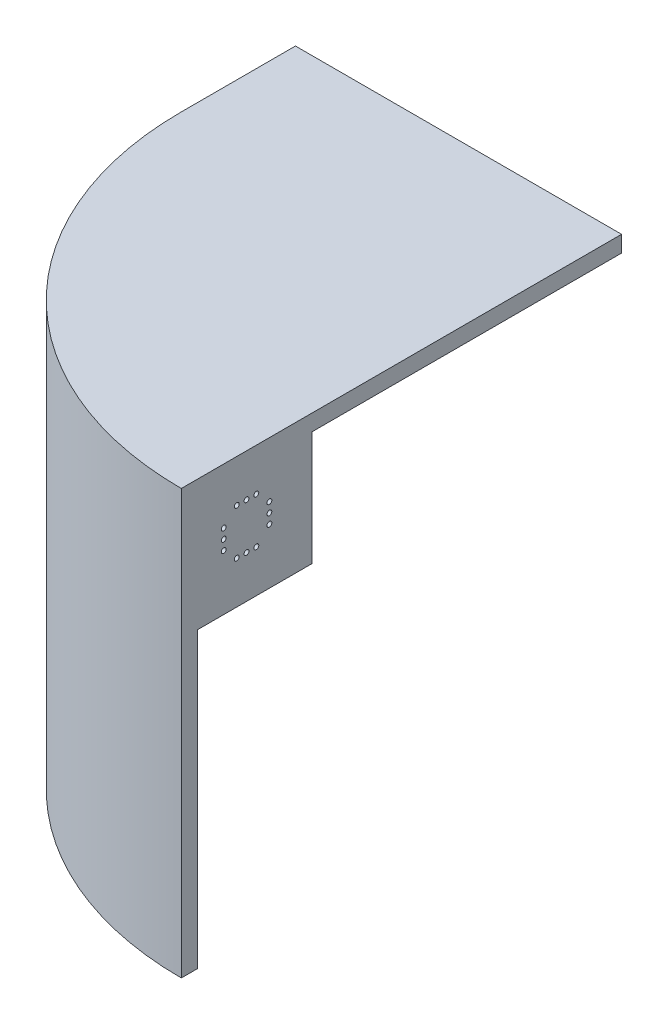
ISO-10303-21;
HEADER;
FILE_DESCRIPTION(('STEP AP214'),'2;1');
FILE_NAME('part.step','',(''),(''),'','','');
FILE_SCHEMA(('AUTOMOTIVE_DESIGN { 1 0 10303 214 1 1 1 1 }'));
ENDSEC;
DATA;
#1=APPLICATION_CONTEXT('core data for automotive mechanical design processes');
#2=APPLICATION_PROTOCOL_DEFINITION('international standard','automotive_design',2000,#1);
#3=PRODUCT_CONTEXT('',#1,'mechanical');
#4=PRODUCT('Part','Part','',(#3));
#5=PRODUCT_RELATED_PRODUCT_CATEGORY('part','',(#4));
#6=PRODUCT_DEFINITION_FORMATION('','',#4);
#7=PRODUCT_DEFINITION_CONTEXT('part definition',#1,'design');
#8=PRODUCT_DEFINITION('design','',#6,#7);
#9=PRODUCT_DEFINITION_SHAPE('','',#8);
#10=(LENGTH_UNIT() NAMED_UNIT(*) SI_UNIT(.MILLI.,.METRE.));
#11=(NAMED_UNIT(*) PLANE_ANGLE_UNIT() SI_UNIT($,.RADIAN.));
#12=(NAMED_UNIT(*) SI_UNIT($,.STERADIAN.) SOLID_ANGLE_UNIT());
#13=UNCERTAINTY_MEASURE_WITH_UNIT(LENGTH_MEASURE(1.E-05),#10,'distance_accuracy_value','');
#14=(GEOMETRIC_REPRESENTATION_CONTEXT(3) GLOBAL_UNCERTAINTY_ASSIGNED_CONTEXT((#13)) GLOBAL_UNIT_ASSIGNED_CONTEXT((#10,
#11,#12)) REPRESENTATION_CONTEXT('',''));
#15=CARTESIAN_POINT('',(0.,0.,0.));
#16=DIRECTION('',(0.,0.,1.));
#17=DIRECTION('',(1.,0.,0.));
#18=AXIS2_PLACEMENT_3D('',#15,#16,#17);
#19=CARTESIAN_POINT('',(0.,130.,-35.));
#20=DIRECTION('',(0.,0.,1.));
#21=DIRECTION('',(1.,0.,0.));
#22=AXIS2_PLACEMENT_3D('',#19,#20,#21);
#23=PLANE('',#22);
#24=DIRECTION('',(1.,0.,0.));
#25=VECTOR('',#24,1.);
#26=CARTESIAN_POINT('',(0.,125.,-35.));
#27=LINE('',#26,#25);
#28=CARTESIAN_POINT('',(-100.,125.,-35.));
#29=VERTEX_POINT('',#28);
#30=CARTESIAN_POINT('',(0.,125.,-35.));
#31=VERTEX_POINT('',#30);
#32=EDGE_CURVE('E142',#29,#31,#27,.T.);
#33=ORIENTED_EDGE('',*,*,#32,.F.);
#34=DIRECTION('',(0.,-1.,0.));
#35=VECTOR('',#34,1.);
#36=CARTESIAN_POINT('',(-100.,130.,-35.));
#37=LINE('',#36,#35);
#38=CARTESIAN_POINT('',(-100.,130.,-35.));
#39=VERTEX_POINT('',#38);
#40=EDGE_CURVE('E176',#39,#29,#37,.T.);
#41=ORIENTED_EDGE('',*,*,#40,.F.);
#42=DIRECTION('',(-1.,0.,0.));
#43=VECTOR('',#42,1.);
#44=CARTESIAN_POINT('',(0.,130.,-35.));
#45=LINE('',#44,#43);
#46=CARTESIAN_POINT('',(0.,130.,-35.));
#47=VERTEX_POINT('',#46);
#48=EDGE_CURVE('E163',#47,#39,#45,.T.);
#49=ORIENTED_EDGE('',*,*,#48,.F.);
#50=DIRECTION('',(0.,-1.,0.));
#51=VECTOR('',#50,1.);
#52=CARTESIAN_POINT('',(0.,130.,-35.));
#53=LINE('',#52,#51);
#54=EDGE_CURVE('E179',#47,#31,#53,.T.);
#55=ORIENTED_EDGE('',*,*,#54,.T.);
#56=EDGE_LOOP('',(#33,#41,#49,#55));
#57=FACE_BOUND('',#56,.T.);
#58=ADVANCED_FACE('F33',(#57),#23,.F.);
#59=CARTESIAN_POINT('',(0.,130.,0.));
#60=DIRECTION('',(0.,-1.,0.));
#61=DIRECTION('',(0.,0.,-1.));
#62=AXIS2_PLACEMENT_3D('',#59,#60,#61);
#63=CYLINDRICAL_SURFACE('',#62,100.);
#64=CARTESIAN_POINT('',(0.,0.,0.));
#65=DIRECTION('',(0.,1.,0.));
#66=DIRECTION('',(0.,0.,1.));
#67=AXIS2_PLACEMENT_3D('',#64,#65,#66);
#68=CIRCLE('',#67,100.);
#69=CARTESIAN_POINT('',(-100.,0.,0.));
#70=VERTEX_POINT('',#69);
#71=CARTESIAN_POINT('',(0.,0.,100.));
#72=VERTEX_POINT('',#71);
#73=EDGE_CURVE('E151',#70,#72,#68,.T.);
#74=ORIENTED_EDGE('',*,*,#73,.T.);
#75=DIRECTION('',(0.,-1.,0.));
#76=VECTOR('',#75,1.);
#77=CARTESIAN_POINT('',(0.,130.,100.));
#78=LINE('',#77,#76);
#79=CARTESIAN_POINT('',(0.,130.,100.));
#80=VERTEX_POINT('',#79);
#81=EDGE_CURVE('E41',#80,#72,#78,.T.);
#82=ORIENTED_EDGE('',*,*,#81,.F.);
#83=CARTESIAN_POINT('',(0.,130.,0.));
#84=DIRECTION('',(0.,1.,0.));
#85=DIRECTION('',(0.,0.,1.));
#86=AXIS2_PLACEMENT_3D('',#83,#84,#85);
#87=CIRCLE('',#86,100.);
#88=CARTESIAN_POINT('',(-100.,130.,0.));
#89=VERTEX_POINT('',#88);
#90=EDGE_CURVE('E157',#89,#80,#87,.T.);
#91=ORIENTED_EDGE('',*,*,#90,.F.);
#92=DIRECTION('',(0.,-1.,0.));
#93=VECTOR('',#92,1.);
#94=CARTESIAN_POINT('',(-100.,130.,0.));
#95=LINE('',#94,#93);
#96=EDGE_CURVE('E167',#89,#70,#95,.T.);
#97=ORIENTED_EDGE('',*,*,#96,.T.);
#98=EDGE_LOOP('',(#74,#82,#91,#97));
#99=FACE_BOUND('',#98,.T.);
#100=ADVANCED_FACE('F35',(#99),#63,.T.);
#101=CARTESIAN_POINT('',(0.,130.,100.));
#102=DIRECTION('',(-1.,0.,0.));
#103=DIRECTION('',(0.,0.,1.));
#104=AXIS2_PLACEMENT_3D('',#101,#102,#103);
#105=PLANE('',#104);
#106=CARTESIAN_POINT('',(0.,103.,82.9999999999995));
#107=DIRECTION('',(1.,0.,0.));
#108=DIRECTION('',(0.,0.,-1.));
#109=AXIS2_PLACEMENT_3D('',#106,#107,#108);
#110=CIRCLE('',#109,0.749999999999995);
#111=CARTESIAN_POINT('',(0.,103.,82.2499999999995));
#112=VERTEX_POINT('',#111);
#113=EDGE_CURVE('E233',#112,#112,#110,.T.);
#114=ORIENTED_EDGE('',*,*,#113,.F.);
#115=EDGE_LOOP('',(#114));
#116=FACE_BOUND('',#115,.T.);
#117=CARTESIAN_POINT('',(0.,103.,76.9999999999995));
#118=DIRECTION('',(1.,0.,0.));
#119=DIRECTION('',(0.,0.,-1.));
#120=AXIS2_PLACEMENT_3D('',#117,#118,#119);
#121=CIRCLE('',#120,0.749999999999995);
#122=CARTESIAN_POINT('',(0.,103.,76.2499999999995));
#123=VERTEX_POINT('',#122);
#124=EDGE_CURVE('E237',#123,#123,#121,.T.);
#125=ORIENTED_EDGE('',*,*,#124,.F.);
#126=EDGE_LOOP('',(#125));
#127=FACE_BOUND('',#126,.T.);
#128=CARTESIAN_POINT('',(0.,103.,79.9999999999995));
#129=DIRECTION('',(1.,0.,0.));
#130=DIRECTION('',(0.,0.,-1.));
#131=AXIS2_PLACEMENT_3D('',#128,#129,#130);
#132=CIRCLE('',#131,0.749999999999995);
#133=CARTESIAN_POINT('',(0.,103.,79.2499999999995));
#134=VERTEX_POINT('',#133);
#135=EDGE_CURVE('E241',#134,#134,#132,.T.);
#136=ORIENTED_EDGE('',*,*,#135,.F.);
#137=EDGE_LOOP('',(#136));
#138=FACE_BOUND('',#137,.T.);
#139=CARTESIAN_POINT('',(0.,117.000000000001,77.0000000000002));
#140=DIRECTION('',(1.,0.,0.));
#141=DIRECTION('',(0.,0.,-1.));
#142=AXIS2_PLACEMENT_3D('',#139,#140,#141);
#143=CIRCLE('',#142,0.749999999999999);
#144=CARTESIAN_POINT('',(0.,117.000000000001,76.2500000000002));
#145=VERTEX_POINT('',#144);
#146=EDGE_CURVE('E245',#145,#145,#143,.T.);
#147=ORIENTED_EDGE('',*,*,#146,.F.);
#148=EDGE_LOOP('',(#147));
#149=FACE_BOUND('',#148,.T.);
#150=CARTESIAN_POINT('',(0.,110.000000000001,72.9999999999997));
#151=DIRECTION('',(1.,0.,0.));
#152=DIRECTION('',(0.,0.,-1.));
#153=AXIS2_PLACEMENT_3D('',#150,#151,#152);
#154=CIRCLE('',#153,0.749999999999995);
#155=CARTESIAN_POINT('',(0.,110.000000000001,72.2499999999997));
#156=VERTEX_POINT('',#155);
#157=EDGE_CURVE('E249',#156,#156,#154,.T.);
#158=ORIENTED_EDGE('',*,*,#157,.F.);
#159=EDGE_LOOP('',(#158));
#160=FACE_BOUND('',#159,.T.);
#161=CARTESIAN_POINT('',(0.,113.000000000001,72.9999999999997));
#162=DIRECTION('',(1.,0.,0.));
#163=DIRECTION('',(0.,0.,-1.));
#164=AXIS2_PLACEMENT_3D('',#161,#162,#163);
#165=CIRCLE('',#164,0.749999999999995);
#166=CARTESIAN_POINT('',(0.,113.000000000001,72.2499999999997));
#167=VERTEX_POINT('',#166);
#168=EDGE_CURVE('E253',#167,#167,#165,.T.);
#169=ORIENTED_EDGE('',*,*,#168,.F.);
#170=EDGE_LOOP('',(#169));
#171=FACE_BOUND('',#170,.T.);
#172=CARTESIAN_POINT('',(0.,107.000000000001,72.9999999999997));
#173=DIRECTION('',(1.,0.,0.));
#174=DIRECTION('',(0.,0.,-1.));
#175=AXIS2_PLACEMENT_3D('',#172,#173,#174);
#176=CIRCLE('',#175,0.749999999999995);
#177=CARTESIAN_POINT('',(0.,107.000000000001,72.2499999999997));
#178=VERTEX_POINT('',#177);
#179=EDGE_CURVE('E257',#178,#178,#176,.T.);
#180=ORIENTED_EDGE('',*,*,#179,.F.);
#181=EDGE_LOOP('',(#180));
#182=FACE_BOUND('',#181,.T.);
#183=CARTESIAN_POINT('',(0.,117.000000000001,83.0000000000002));
#184=DIRECTION('',(1.,0.,0.));
#185=DIRECTION('',(0.,0.,-1.));
#186=AXIS2_PLACEMENT_3D('',#183,#184,#185);
#187=CIRCLE('',#186,0.749999999999999);
#188=CARTESIAN_POINT('',(0.,117.000000000001,82.2500000000002));
#189=VERTEX_POINT('',#188);
#190=EDGE_CURVE('E261',#189,#189,#187,.T.);
#191=ORIENTED_EDGE('',*,*,#190,.F.);
#192=EDGE_LOOP('',(#191));
#193=FACE_BOUND('',#192,.T.);
#194=CARTESIAN_POINT('',(0.,117.000000000001,80.0000000000002));
#195=DIRECTION('',(1.,0.,0.));
#196=DIRECTION('',(0.,0.,-1.));
#197=AXIS2_PLACEMENT_3D('',#194,#195,#196);
#198=CIRCLE('',#197,0.749999999999999);
#199=CARTESIAN_POINT('',(0.,117.000000000001,79.2500000000002));
#200=VERTEX_POINT('',#199);
#201=EDGE_CURVE('E265',#200,#200,#198,.T.);
#202=ORIENTED_EDGE('',*,*,#201,.F.);
#203=EDGE_LOOP('',(#202));
#204=FACE_BOUND('',#203,.T.);
#205=CARTESIAN_POINT('',(0.,113.,87.));
#206=DIRECTION('',(1.,0.,0.));
#207=DIRECTION('',(0.,0.,-1.));
#208=AXIS2_PLACEMENT_3D('',#205,#206,#207);
#209=CIRCLE('',#208,0.749999999999999);
#210=CARTESIAN_POINT('',(0.,113.,86.25));
#211=VERTEX_POINT('',#210);
#212=EDGE_CURVE('E269',#211,#211,#209,.T.);
#213=ORIENTED_EDGE('',*,*,#212,.F.);
#214=EDGE_LOOP('',(#213));
#215=FACE_BOUND('',#214,.T.);
#216=CARTESIAN_POINT('',(0.,107.,87.));
#217=DIRECTION('',(1.,0.,0.));
#218=DIRECTION('',(0.,0.,-1.));
#219=AXIS2_PLACEMENT_3D('',#216,#217,#218);
#220=CIRCLE('',#219,0.749999999999999);
#221=CARTESIAN_POINT('',(0.,107.,86.25));
#222=VERTEX_POINT('',#221);
#223=EDGE_CURVE('E273',#222,#222,#220,.T.);
#224=ORIENTED_EDGE('',*,*,#223,.F.);
#225=EDGE_LOOP('',(#224));
#226=FACE_BOUND('',#225,.T.);
#227=CARTESIAN_POINT('',(0.,110.,87.));
#228=DIRECTION('',(1.,0.,0.));
#229=DIRECTION('',(0.,0.,-1.));
#230=AXIS2_PLACEMENT_3D('',#227,#228,#229);
#231=CIRCLE('',#230,0.749999999999999);
#232=CARTESIAN_POINT('',(0.,110.,86.25));
#233=VERTEX_POINT('',#232);
#234=EDGE_CURVE('E276',#233,#233,#231,.T.);
#235=ORIENTED_EDGE('',*,*,#234,.F.);
#236=EDGE_LOOP('',(#235));
#237=FACE_BOUND('',#236,.T.);
#238=DIRECTION('',(0.,-1.,0.));
#239=VECTOR('',#238,1.);
#240=CARTESIAN_POINT('',(0.,125.,95.));
#241=LINE('',#240,#239);
#242=CARTESIAN_POINT('',(0.,90.,95.));
#243=VERTEX_POINT('',#242);
#244=CARTESIAN_POINT('',(0.,0.,95.));
#245=VERTEX_POINT('',#244);
#246=EDGE_CURVE('E149',#243,#245,#241,.T.);
#247=ORIENTED_EDGE('',*,*,#246,.F.);
#248=DIRECTION('',(0.,0.,-1.));
#249=VECTOR('',#248,1.);
#250=CARTESIAN_POINT('',(0.,90.,95.));
#251=LINE('',#250,#249);
#252=CARTESIAN_POINT('',(0.,90.,60.));
#253=VERTEX_POINT('',#252);
#254=EDGE_CURVE('E129',#243,#253,#251,.T.);
#255=ORIENTED_EDGE('',*,*,#254,.T.);
#256=DIRECTION('',(0.,1.,0.));
#257=VECTOR('',#256,1.);
#258=CARTESIAN_POINT('',(0.,125.,60.));
#259=LINE('',#258,#257);
#260=CARTESIAN_POINT('',(0.,125.,60.));
#261=VERTEX_POINT('',#260);
#262=EDGE_CURVE('E112',#253,#261,#259,.T.);
#263=ORIENTED_EDGE('',*,*,#262,.T.);
#264=DIRECTION('',(0.,0.,1.));
#265=VECTOR('',#264,1.);
#266=CARTESIAN_POINT('',(0.,125.,95.));
#267=LINE('',#266,#265);
#268=EDGE_CURVE('E144',#31,#261,#267,.T.);
#269=ORIENTED_EDGE('',*,*,#268,.F.);
#270=ORIENTED_EDGE('',*,*,#54,.F.);
#271=DIRECTION('',(0.,0.,-1.));
#272=VECTOR('',#271,1.);
#273=CARTESIAN_POINT('',(0.,130.,100.));
#274=LINE('',#273,#272);
#275=EDGE_CURVE('E160',#80,#47,#274,.T.);
#276=ORIENTED_EDGE('',*,*,#275,.F.);
#277=ORIENTED_EDGE('',*,*,#81,.T.);
#278=DIRECTION('',(0.,0.,-1.));
#279=VECTOR('',#278,1.);
#280=CARTESIAN_POINT('',(0.,0.,100.));
#281=LINE('',#280,#279);
#282=EDGE_CURVE('E170',#72,#245,#281,.T.);
#283=ORIENTED_EDGE('',*,*,#282,.T.);
#284=EDGE_LOOP('',(#247,#255,#263,#269,#270,#276,#277,#283));
#285=FACE_BOUND('',#284,.T.);
#286=ADVANCED_FACE('F184',(#116,#127,#138,#149,#160,#171,#182,#193,#204,#215,#226,#237,#285),
#105,.F.);
#287=CARTESIAN_POINT('',(-100.,130.,-35.));
#288=DIRECTION('',(1.,0.,0.));
#289=DIRECTION('',(0.,0.,-1.));
#290=AXIS2_PLACEMENT_3D('',#287,#288,#289);
#291=PLANE('',#290);
#292=DIRECTION('',(0.,0.,1.));
#293=VECTOR('',#292,1.);
#294=CARTESIAN_POINT('',(-100.,0.,-35.));
#295=LINE('',#294,#293);
#296=CARTESIAN_POINT('',(-100.,0.,-35.));
#297=VERTEX_POINT('',#296);
#298=EDGE_CURVE('E161',#297,#70,#295,.T.);
#299=ORIENTED_EDGE('',*,*,#298,.T.);
#300=ORIENTED_EDGE('',*,*,#96,.F.);
#301=DIRECTION('',(0.,0.,1.));
#302=VECTOR('',#301,1.);
#303=CARTESIAN_POINT('',(-100.,130.,-35.));
#304=LINE('',#303,#302);
#305=EDGE_CURVE('E165',#39,#89,#304,.T.);
#306=ORIENTED_EDGE('',*,*,#305,.F.);
#307=ORIENTED_EDGE('',*,*,#40,.T.);
#308=DIRECTION('',(0.,-1.,0.));
#309=VECTOR('',#308,1.);
#310=CARTESIAN_POINT('',(-100.,125.,-35.));
#311=LINE('',#310,#309);
#312=EDGE_CURVE('E152',#29,#297,#311,.T.);
#313=ORIENTED_EDGE('',*,*,#312,.T.);
#314=EDGE_LOOP('',(#299,#300,#306,#307,#313));
#315=FACE_BOUND('',#314,.T.);
#316=ADVANCED_FACE('F209',(#315),#291,.F.);
#317=CARTESIAN_POINT('',(0.,130.,0.));
#318=DIRECTION('',(0.,1.,0.));
#319=DIRECTION('',(0.,0.,1.));
#320=AXIS2_PLACEMENT_3D('',#317,#318,#319);
#321=PLANE('',#320);
#322=ORIENTED_EDGE('',*,*,#90,.T.);
#323=ORIENTED_EDGE('',*,*,#275,.T.);
#324=ORIENTED_EDGE('',*,*,#48,.T.);
#325=ORIENTED_EDGE('',*,*,#305,.T.);
#326=EDGE_LOOP('',(#322,#323,#324,#325));
#327=FACE_BOUND('',#326,.T.);
#328=ADVANCED_FACE('F211',(#327),#321,.T.);
#329=CARTESIAN_POINT('',(0.,0.,0.));
#330=DIRECTION('',(0.,1.,0.));
#331=DIRECTION('',(0.,0.,1.));
#332=AXIS2_PLACEMENT_3D('',#329,#330,#331);
#333=PLANE('',#332);
#334=DIRECTION('',(-0.14142135623731,0.,-0.989949493661166));
#335=VECTOR('',#334,1.);
#336=CARTESIAN_POINT('',(-100.,0.,-35.));
#337=LINE('',#336,#335);
#338=CARTESIAN_POINT('',(-95.,0.,0.));
#339=VERTEX_POINT('',#338);
#340=EDGE_CURVE('E139',#339,#297,#337,.T.);
#341=ORIENTED_EDGE('',*,*,#340,.F.);
#342=CARTESIAN_POINT('',(0.,0.,0.));
#343=DIRECTION('',(0.,-1.,0.));
#344=DIRECTION('',(0.,0.,-1.));
#345=AXIS2_PLACEMENT_3D('',#342,#343,#344);
#346=CIRCLE('',#345,95.);
#347=EDGE_CURVE('E135',#245,#339,#346,.T.);
#348=ORIENTED_EDGE('',*,*,#347,.F.);
#349=ORIENTED_EDGE('',*,*,#282,.F.);
#350=ORIENTED_EDGE('',*,*,#73,.F.);
#351=ORIENTED_EDGE('',*,*,#298,.F.);
#352=EDGE_LOOP('',(#341,#348,#349,#350,#351));
#353=FACE_BOUND('',#352,.T.);
#354=ADVANCED_FACE('F193',(#353),#333,.F.);
#355=CARTESIAN_POINT('',(0.,125.,0.));
#356=DIRECTION('',(0.,-1.,0.));
#357=DIRECTION('',(0.,0.,-1.));
#358=AXIS2_PLACEMENT_3D('',#355,#356,#357);
#359=CYLINDRICAL_SURFACE('',#358,95.);
#360=DIRECTION('',(0.,-1.,0.));
#361=VECTOR('',#360,1.);
#362=CARTESIAN_POINT('',(-5.,125.,94.8683298050514));
#363=LINE('',#362,#361);
#364=CARTESIAN_POINT('',(-5.,90.,94.8683298050514));
#365=VERTEX_POINT('',#364);
#366=CARTESIAN_POINT('',(-5.,125.,94.8683298050514));
#367=VERTEX_POINT('',#366);
#368=EDGE_CURVE('E47',#365,#367,#363,.F.);
#369=ORIENTED_EDGE('',*,*,#368,.F.);
#370=CARTESIAN_POINT('',(0.,90.,0.));
#371=DIRECTION('',(0.,-1.,0.));
#372=DIRECTION('',(0.,0.,-1.));
#373=AXIS2_PLACEMENT_3D('',#370,#371,#372);
#374=CIRCLE('',#373,95.);
#375=EDGE_CURVE('E11',#365,#243,#374,.F.);
#376=ORIENTED_EDGE('',*,*,#375,.T.);
#377=ORIENTED_EDGE('',*,*,#246,.T.);
#378=ORIENTED_EDGE('',*,*,#347,.T.);
#379=DIRECTION('',(0.,-1.,0.));
#380=VECTOR('',#379,1.);
#381=CARTESIAN_POINT('',(-95.,125.,0.));
#382=LINE('',#381,#380);
#383=CARTESIAN_POINT('',(-95.,125.,0.));
#384=VERTEX_POINT('',#383);
#385=EDGE_CURVE('E146',#384,#339,#382,.T.);
#386=ORIENTED_EDGE('',*,*,#385,.F.);
#387=CARTESIAN_POINT('',(0.,125.,0.));
#388=DIRECTION('',(0.,-1.,0.));
#389=DIRECTION('',(0.,0.,-1.));
#390=AXIS2_PLACEMENT_3D('',#387,#388,#389);
#391=CIRCLE('',#390,95.);
#392=EDGE_CURVE('E136',#367,#384,#391,.T.);
#393=ORIENTED_EDGE('',*,*,#392,.F.);
#394=EDGE_LOOP('',(#369,#376,#377,#378,#386,#393));
#395=FACE_BOUND('',#394,.T.);
#396=ADVANCED_FACE('F196',(#395),#359,.F.);
#397=CARTESIAN_POINT('',(-100.,125.,-35.));
#398=DIRECTION('',(-0.989949493661167,0.,0.14142135623731));
#399=DIRECTION('',(0.14142135623731,0.,0.989949493661166));
#400=AXIS2_PLACEMENT_3D('',#397,#398,#399);
#401=PLANE('',#400);
#402=ORIENTED_EDGE('',*,*,#340,.T.);
#403=ORIENTED_EDGE('',*,*,#312,.F.);
#404=DIRECTION('',(-0.14142135623731,0.,-0.989949493661166));
#405=VECTOR('',#404,1.);
#406=CARTESIAN_POINT('',(-100.,125.,-35.));
#407=LINE('',#406,#405);
#408=EDGE_CURVE('E138',#384,#29,#407,.T.);
#409=ORIENTED_EDGE('',*,*,#408,.F.);
#410=ORIENTED_EDGE('',*,*,#385,.T.);
#411=EDGE_LOOP('',(#402,#403,#409,#410));
#412=FACE_BOUND('',#411,.T.);
#413=ADVANCED_FACE('F199',(#412),#401,.F.);
#414=CARTESIAN_POINT('',(0.,125.,0.));
#415=DIRECTION('',(0.,-1.,0.));
#416=DIRECTION('',(0.,0.,-1.));
#417=AXIS2_PLACEMENT_3D('',#414,#415,#416);
#418=PLANE('',#417);
#419=DIRECTION('',(1.,0.,0.));
#420=VECTOR('',#419,1.);
#421=CARTESIAN_POINT('',(-5.,125.,60.));
#422=LINE('',#421,#420);
#423=CARTESIAN_POINT('',(-5.,125.,60.));
#424=VERTEX_POINT('',#423);
#425=EDGE_CURVE('E121',#424,#261,#422,.T.);
#426=ORIENTED_EDGE('',*,*,#425,.F.);
#427=DIRECTION('',(0.,0.,1.));
#428=VECTOR('',#427,1.);
#429=CARTESIAN_POINT('',(-5.,125.,95.));
#430=LINE('',#429,#428);
#431=EDGE_CURVE('E122',#424,#367,#430,.T.);
#432=ORIENTED_EDGE('',*,*,#431,.T.);
#433=ORIENTED_EDGE('',*,*,#392,.T.);
#434=ORIENTED_EDGE('',*,*,#408,.T.);
#435=ORIENTED_EDGE('',*,*,#32,.T.);
#436=ORIENTED_EDGE('',*,*,#268,.T.);
#437=EDGE_LOOP('',(#426,#432,#433,#434,#435,#436));
#438=FACE_BOUND('',#437,.T.);
#439=ADVANCED_FACE('F202',(#438),#418,.T.);
#440=CARTESIAN_POINT('',(-5.,90.,95.));
#441=DIRECTION('',(0.,-1.,0.));
#442=DIRECTION('',(0.,0.,-1.));
#443=AXIS2_PLACEMENT_3D('',#440,#441,#442);
#444=PLANE('',#443);
#445=ORIENTED_EDGE('',*,*,#375,.F.);
#446=DIRECTION('',(0.,0.,-1.));
#447=VECTOR('',#446,1.);
#448=CARTESIAN_POINT('',(-5.,90.,95.));
#449=LINE('',#448,#447);
#450=CARTESIAN_POINT('',(-5.,90.,60.));
#451=VERTEX_POINT('',#450);
#452=EDGE_CURVE('E103',#365,#451,#449,.T.);
#453=ORIENTED_EDGE('',*,*,#452,.T.);
#454=DIRECTION('',(1.,0.,0.));
#455=VECTOR('',#454,1.);
#456=CARTESIAN_POINT('',(-5.,90.,60.));
#457=LINE('',#456,#455);
#458=EDGE_CURVE('E107',#451,#253,#457,.T.);
#459=ORIENTED_EDGE('',*,*,#458,.T.);
#460=ORIENTED_EDGE('',*,*,#254,.F.);
#461=EDGE_LOOP('',(#445,#453,#459,#460));
#462=FACE_BOUND('',#461,.T.);
#463=ADVANCED_FACE('F105',(#462),#444,.T.);
#464=CARTESIAN_POINT('',(-5.,0.,0.));
#465=DIRECTION('',(1.,0.,0.));
#466=DIRECTION('',(0.,0.,-1.));
#467=AXIS2_PLACEMENT_3D('',#464,#465,#466);
#468=PLANE('',#467);
#469=CARTESIAN_POINT('',(-5.,103.,82.9999999999995));
#470=DIRECTION('',(1.,0.,0.));
#471=DIRECTION('',(0.,0.,-1.));
#472=AXIS2_PLACEMENT_3D('',#469,#470,#471);
#473=CIRCLE('',#472,0.749999999999995);
#474=CARTESIAN_POINT('',(-5.,103.,82.2499999999995));
#475=VERTEX_POINT('',#474);
#476=EDGE_CURVE('E284',#475,#475,#473,.F.);
#477=ORIENTED_EDGE('',*,*,#476,.F.);
#478=EDGE_LOOP('',(#477));
#479=FACE_BOUND('',#478,.T.);
#480=CARTESIAN_POINT('',(-5.,103.,76.9999999999995));
#481=DIRECTION('',(1.,0.,0.));
#482=DIRECTION('',(0.,0.,-1.));
#483=AXIS2_PLACEMENT_3D('',#480,#481,#482);
#484=CIRCLE('',#483,0.749999999999995);
#485=CARTESIAN_POINT('',(-5.,103.,76.2499999999995));
#486=VERTEX_POINT('',#485);
#487=EDGE_CURVE('E288',#486,#486,#484,.F.);
#488=ORIENTED_EDGE('',*,*,#487,.F.);
#489=EDGE_LOOP('',(#488));
#490=FACE_BOUND('',#489,.T.);
#491=CARTESIAN_POINT('',(-5.,103.,79.9999999999995));
#492=DIRECTION('',(1.,0.,0.));
#493=DIRECTION('',(0.,0.,-1.));
#494=AXIS2_PLACEMENT_3D('',#491,#492,#493);
#495=CIRCLE('',#494,0.749999999999995);
#496=CARTESIAN_POINT('',(-5.,103.,79.2499999999995));
#497=VERTEX_POINT('',#496);
#498=EDGE_CURVE('E292',#497,#497,#495,.F.);
#499=ORIENTED_EDGE('',*,*,#498,.F.);
#500=EDGE_LOOP('',(#499));
#501=FACE_BOUND('',#500,.T.);
#502=CARTESIAN_POINT('',(-5.,117.000000000001,77.0000000000002));
#503=DIRECTION('',(1.,0.,0.));
#504=DIRECTION('',(0.,0.,-1.));
#505=AXIS2_PLACEMENT_3D('',#502,#503,#504);
#506=CIRCLE('',#505,0.749999999999999);
#507=CARTESIAN_POINT('',(-5.,117.000000000001,76.2500000000002));
#508=VERTEX_POINT('',#507);
#509=EDGE_CURVE('E301',#508,#508,#506,.F.);
#510=ORIENTED_EDGE('',*,*,#509,.F.);
#511=EDGE_LOOP('',(#510));
#512=FACE_BOUND('',#511,.T.);
#513=CARTESIAN_POINT('',(-5.,110.000000000001,72.9999999999997));
#514=DIRECTION('',(1.,0.,0.));
#515=DIRECTION('',(0.,0.,-1.));
#516=AXIS2_PLACEMENT_3D('',#513,#514,#515);
#517=CIRCLE('',#516,0.749999999999995);
#518=CARTESIAN_POINT('',(-5.,110.000000000001,72.2499999999997));
#519=VERTEX_POINT('',#518);
#520=EDGE_CURVE('E296',#519,#519,#517,.F.);
#521=ORIENTED_EDGE('',*,*,#520,.F.);
#522=EDGE_LOOP('',(#521));
#523=FACE_BOUND('',#522,.T.);
#524=CARTESIAN_POINT('',(-5.,113.000000000001,72.9999999999997));
#525=DIRECTION('',(1.,0.,0.));
#526=DIRECTION('',(0.,0.,-1.));
#527=AXIS2_PLACEMENT_3D('',#524,#525,#526);
#528=CIRCLE('',#527,0.749999999999995);
#529=CARTESIAN_POINT('',(-5.,113.000000000001,72.2499999999997));
#530=VERTEX_POINT('',#529);
#531=EDGE_CURVE('E300',#530,#530,#528,.F.);
#532=ORIENTED_EDGE('',*,*,#531,.F.);
#533=EDGE_LOOP('',(#532));
#534=FACE_BOUND('',#533,.T.);
#535=CARTESIAN_POINT('',(-5.,107.000000000001,72.9999999999997));
#536=DIRECTION('',(1.,0.,0.));
#537=DIRECTION('',(0.,0.,-1.));
#538=AXIS2_PLACEMENT_3D('',#535,#536,#537);
#539=CIRCLE('',#538,0.749999999999995);
#540=CARTESIAN_POINT('',(-5.,107.000000000001,72.2499999999997));
#541=VERTEX_POINT('',#540);
#542=EDGE_CURVE('E305',#541,#541,#539,.F.);
#543=ORIENTED_EDGE('',*,*,#542,.F.);
#544=EDGE_LOOP('',(#543));
#545=FACE_BOUND('',#544,.T.);
#546=CARTESIAN_POINT('',(-5.,117.000000000001,83.0000000000002));
#547=DIRECTION('',(1.,0.,0.));
#548=DIRECTION('',(0.,0.,-1.));
#549=AXIS2_PLACEMENT_3D('',#546,#547,#548);
#550=CIRCLE('',#549,0.749999999999999);
#551=CARTESIAN_POINT('',(-5.,117.000000000001,82.2500000000002));
#552=VERTEX_POINT('',#551);
#553=EDGE_CURVE('E312',#552,#552,#550,.F.);
#554=ORIENTED_EDGE('',*,*,#553,.F.);
#555=EDGE_LOOP('',(#554));
#556=FACE_BOUND('',#555,.T.);
#557=CARTESIAN_POINT('',(-5.,117.000000000001,80.0000000000002));
#558=DIRECTION('',(1.,0.,0.));
#559=DIRECTION('',(0.,0.,-1.));
#560=AXIS2_PLACEMENT_3D('',#557,#558,#559);
#561=CIRCLE('',#560,0.749999999999999);
#562=CARTESIAN_POINT('',(-5.,117.000000000001,79.2500000000002));
#563=VERTEX_POINT('',#562);
#564=EDGE_CURVE('E316',#563,#563,#561,.F.);
#565=ORIENTED_EDGE('',*,*,#564,.F.);
#566=EDGE_LOOP('',(#565));
#567=FACE_BOUND('',#566,.T.);
#568=CARTESIAN_POINT('',(-5.,113.,87.));
#569=DIRECTION('',(1.,0.,0.));
#570=DIRECTION('',(0.,0.,-1.));
#571=AXIS2_PLACEMENT_3D('',#568,#569,#570);
#572=CIRCLE('',#571,0.749999999999999);
#573=CARTESIAN_POINT('',(-5.,113.,86.25));
#574=VERTEX_POINT('',#573);
#575=EDGE_CURVE('E320',#574,#574,#572,.F.);
#576=ORIENTED_EDGE('',*,*,#575,.F.);
#577=EDGE_LOOP('',(#576));
#578=FACE_BOUND('',#577,.T.);
#579=CARTESIAN_POINT('',(-5.,107.,87.));
#580=DIRECTION('',(1.,0.,0.));
#581=DIRECTION('',(0.,0.,-1.));
#582=AXIS2_PLACEMENT_3D('',#579,#580,#581);
#583=CIRCLE('',#582,0.749999999999999);
#584=CARTESIAN_POINT('',(-5.,107.,86.25));
#585=VERTEX_POINT('',#584);
#586=EDGE_CURVE('E278',#585,#585,#583,.F.);
#587=ORIENTED_EDGE('',*,*,#586,.F.);
#588=EDGE_LOOP('',(#587));
#589=FACE_BOUND('',#588,.T.);
#590=CARTESIAN_POINT('',(-5.,110.,87.));
#591=DIRECTION('',(1.,0.,0.));
#592=DIRECTION('',(0.,0.,-1.));
#593=AXIS2_PLACEMENT_3D('',#590,#591,#592);
#594=CIRCLE('',#593,0.749999999999999);
#595=CARTESIAN_POINT('',(-5.,110.,86.25));
#596=VERTEX_POINT('',#595);
#597=EDGE_CURVE('E131',#596,#596,#594,.F.);
#598=ORIENTED_EDGE('',*,*,#597,.F.);
#599=EDGE_LOOP('',(#598));
#600=FACE_BOUND('',#599,.T.);
#601=ORIENTED_EDGE('',*,*,#452,.F.);
#602=ORIENTED_EDGE('',*,*,#368,.T.);
#603=ORIENTED_EDGE('',*,*,#431,.F.);
#604=DIRECTION('',(0.,1.,0.));
#605=VECTOR('',#604,1.);
#606=CARTESIAN_POINT('',(-5.,125.,60.));
#607=LINE('',#606,#605);
#608=EDGE_CURVE('E111',#451,#424,#607,.T.);
#609=ORIENTED_EDGE('',*,*,#608,.F.);
#610=EDGE_LOOP('',(#601,#602,#603,#609));
#611=FACE_BOUND('',#610,.T.);
#612=ADVANCED_FACE('F124',(#479,#490,#501,#512,#523,#534,#545,#556,#567,#578,#589,#600,#611),
#468,.F.);
#613=CARTESIAN_POINT('',(-5.,125.,60.));
#614=DIRECTION('',(0.,0.,-1.));
#615=DIRECTION('',(-1.,0.,0.));
#616=AXIS2_PLACEMENT_3D('',#613,#614,#615);
#617=PLANE('',#616);
#618=ORIENTED_EDGE('',*,*,#262,.F.);
#619=ORIENTED_EDGE('',*,*,#458,.F.);
#620=ORIENTED_EDGE('',*,*,#608,.T.);
#621=ORIENTED_EDGE('',*,*,#425,.T.);
#622=EDGE_LOOP('',(#618,#619,#620,#621));
#623=FACE_BOUND('',#622,.T.);
#624=ADVANCED_FACE('F116',(#623),#617,.T.);
#625=CARTESIAN_POINT('',(-7.12132034355964,110.,87.));
#626=DIRECTION('',(1.,0.,0.));
#627=DIRECTION('',(0.,0.,-1.));
#628=AXIS2_PLACEMENT_3D('',#625,#626,#627);
#629=CYLINDRICAL_SURFACE('',#628,0.749999999999999);
#630=ORIENTED_EDGE('',*,*,#597,.T.);
#631=EDGE_LOOP('',(#630));
#632=FACE_BOUND('',#631,.T.);
#633=ORIENTED_EDGE('',*,*,#234,.T.);
#634=EDGE_LOOP('',(#633));
#635=FACE_BOUND('',#634,.T.);
#636=ADVANCED_FACE('F328',(#632,#635),#629,.F.);
#637=CARTESIAN_POINT('',(-7.12132034355964,107.,87.));
#638=DIRECTION('',(1.,0.,0.));
#639=DIRECTION('',(0.,0.,-1.));
#640=AXIS2_PLACEMENT_3D('',#637,#638,#639);
#641=CYLINDRICAL_SURFACE('',#640,0.749999999999999);
#642=ORIENTED_EDGE('',*,*,#586,.T.);
#643=EDGE_LOOP('',(#642));
#644=FACE_BOUND('',#643,.T.);
#645=ORIENTED_EDGE('',*,*,#223,.T.);
#646=EDGE_LOOP('',(#645));
#647=FACE_BOUND('',#646,.T.);
#648=ADVANCED_FACE('F325',(#644,#647),#641,.F.);
#649=CARTESIAN_POINT('',(-7.12132034355964,113.,87.));
#650=DIRECTION('',(1.,0.,0.));
#651=DIRECTION('',(0.,0.,-1.));
#652=AXIS2_PLACEMENT_3D('',#649,#650,#651);
#653=CYLINDRICAL_SURFACE('',#652,0.749999999999999);
#654=ORIENTED_EDGE('',*,*,#575,.T.);
#655=EDGE_LOOP('',(#654));
#656=FACE_BOUND('',#655,.T.);
#657=ORIENTED_EDGE('',*,*,#212,.T.);
#658=EDGE_LOOP('',(#657));
#659=FACE_BOUND('',#658,.T.);
#660=ADVANCED_FACE('F327',(#656,#659),#653,.F.);
#661=CARTESIAN_POINT('',(-7.12132034355964,117.000000000001,80.0000000000002));
#662=DIRECTION('',(1.,0.,0.));
#663=DIRECTION('',(0.,0.,-1.));
#664=AXIS2_PLACEMENT_3D('',#661,#662,#663);
#665=CYLINDRICAL_SURFACE('',#664,0.749999999999999);
#666=ORIENTED_EDGE('',*,*,#564,.T.);
#667=EDGE_LOOP('',(#666));
#668=FACE_BOUND('',#667,.T.);
#669=ORIENTED_EDGE('',*,*,#201,.T.);
#670=EDGE_LOOP('',(#669));
#671=FACE_BOUND('',#670,.T.);
#672=ADVANCED_FACE('F335',(#668,#671),#665,.F.);
#673=CARTESIAN_POINT('',(-7.12132034355964,117.000000000001,83.0000000000002));
#674=DIRECTION('',(1.,0.,0.));
#675=DIRECTION('',(0.,0.,-1.));
#676=AXIS2_PLACEMENT_3D('',#673,#674,#675);
#677=CYLINDRICAL_SURFACE('',#676,0.749999999999999);
#678=ORIENTED_EDGE('',*,*,#553,.T.);
#679=EDGE_LOOP('',(#678));
#680=FACE_BOUND('',#679,.T.);
#681=ORIENTED_EDGE('',*,*,#190,.T.);
#682=EDGE_LOOP('',(#681));
#683=FACE_BOUND('',#682,.T.);
#684=ADVANCED_FACE('F343',(#680,#683),#677,.F.);
#685=CARTESIAN_POINT('',(-7.12132034355964,107.000000000001,72.9999999999997));
#686=DIRECTION('',(1.,0.,0.));
#687=DIRECTION('',(0.,0.,-1.));
#688=AXIS2_PLACEMENT_3D('',#685,#686,#687);
#689=CYLINDRICAL_SURFACE('',#688,0.749999999999995);
#690=ORIENTED_EDGE('',*,*,#542,.T.);
#691=EDGE_LOOP('',(#690));
#692=FACE_BOUND('',#691,.T.);
#693=ORIENTED_EDGE('',*,*,#179,.T.);
#694=EDGE_LOOP('',(#693));
#695=FACE_BOUND('',#694,.T.);
#696=ADVANCED_FACE('F347',(#692,#695),#689,.F.);
#697=CARTESIAN_POINT('',(-7.12132034355964,113.000000000001,72.9999999999997));
#698=DIRECTION('',(1.,0.,0.));
#699=DIRECTION('',(0.,0.,-1.));
#700=AXIS2_PLACEMENT_3D('',#697,#698,#699);
#701=CYLINDRICAL_SURFACE('',#700,0.749999999999995);
#702=ORIENTED_EDGE('',*,*,#531,.T.);
#703=EDGE_LOOP('',(#702));
#704=FACE_BOUND('',#703,.T.);
#705=ORIENTED_EDGE('',*,*,#168,.T.);
#706=EDGE_LOOP('',(#705));
#707=FACE_BOUND('',#706,.T.);
#708=ADVANCED_FACE('F349',(#704,#707),#701,.F.);
#709=CARTESIAN_POINT('',(-7.12132034355964,110.000000000001,72.9999999999997));
#710=DIRECTION('',(1.,0.,0.));
#711=DIRECTION('',(0.,0.,-1.));
#712=AXIS2_PLACEMENT_3D('',#709,#710,#711);
#713=CYLINDRICAL_SURFACE('',#712,0.749999999999995);
#714=ORIENTED_EDGE('',*,*,#520,.T.);
#715=EDGE_LOOP('',(#714));
#716=FACE_BOUND('',#715,.T.);
#717=ORIENTED_EDGE('',*,*,#157,.T.);
#718=EDGE_LOOP('',(#717));
#719=FACE_BOUND('',#718,.T.);
#720=ADVANCED_FACE('F352',(#716,#719),#713,.F.);
#721=CARTESIAN_POINT('',(-7.12132034355964,117.000000000001,77.0000000000002));
#722=DIRECTION('',(1.,0.,0.));
#723=DIRECTION('',(0.,0.,-1.));
#724=AXIS2_PLACEMENT_3D('',#721,#722,#723);
#725=CYLINDRICAL_SURFACE('',#724,0.749999999999999);
#726=ORIENTED_EDGE('',*,*,#509,.T.);
#727=EDGE_LOOP('',(#726));
#728=FACE_BOUND('',#727,.T.);
#729=ORIENTED_EDGE('',*,*,#146,.T.);
#730=EDGE_LOOP('',(#729));
#731=FACE_BOUND('',#730,.T.);
#732=ADVANCED_FACE('F357',(#728,#731),#725,.F.);
#733=CARTESIAN_POINT('',(-7.12132034355964,103.,79.9999999999995));
#734=DIRECTION('',(1.,0.,0.));
#735=DIRECTION('',(0.,0.,-1.));
#736=AXIS2_PLACEMENT_3D('',#733,#734,#735);
#737=CYLINDRICAL_SURFACE('',#736,0.749999999999995);
#738=ORIENTED_EDGE('',*,*,#498,.T.);
#739=EDGE_LOOP('',(#738));
#740=FACE_BOUND('',#739,.T.);
#741=ORIENTED_EDGE('',*,*,#135,.T.);
#742=EDGE_LOOP('',(#741));
#743=FACE_BOUND('',#742,.T.);
#744=ADVANCED_FACE('F360',(#740,#743),#737,.F.);
#745=CARTESIAN_POINT('',(-7.12132034355964,103.,76.9999999999995));
#746=DIRECTION('',(1.,0.,0.));
#747=DIRECTION('',(0.,0.,-1.));
#748=AXIS2_PLACEMENT_3D('',#745,#746,#747);
#749=CYLINDRICAL_SURFACE('',#748,0.749999999999995);
#750=ORIENTED_EDGE('',*,*,#487,.T.);
#751=EDGE_LOOP('',(#750));
#752=FACE_BOUND('',#751,.T.);
#753=ORIENTED_EDGE('',*,*,#124,.T.);
#754=EDGE_LOOP('',(#753));
#755=FACE_BOUND('',#754,.T.);
#756=ADVANCED_FACE('F367',(#752,#755),#749,.F.);
#757=CARTESIAN_POINT('',(-7.12132034355964,103.,82.9999999999995));
#758=DIRECTION('',(1.,0.,0.));
#759=DIRECTION('',(0.,0.,-1.));
#760=AXIS2_PLACEMENT_3D('',#757,#758,#759);
#761=CYLINDRICAL_SURFACE('',#760,0.749999999999995);
#762=ORIENTED_EDGE('',*,*,#476,.T.);
#763=EDGE_LOOP('',(#762));
#764=FACE_BOUND('',#763,.T.);
#765=ORIENTED_EDGE('',*,*,#113,.T.);
#766=EDGE_LOOP('',(#765));
#767=FACE_BOUND('',#766,.T.);
#768=ADVANCED_FACE('F371',(#764,#767),#761,.F.);
#769=CLOSED_SHELL('',(#58,#100,#286,#316,#328,#354,#396,#413,#439,#463,#612,#624,#636,#648,#660,
#672,#684,#696,#708,#720,#732,#744,#756,#768));
#770=MANIFOLD_SOLID_BREP('B2',#769);
#771=ADVANCED_BREP_SHAPE_REPRESENTATION('',(#18,#770),#14);
#772=SHAPE_DEFINITION_REPRESENTATION(#9,#771);
ENDSEC;
END-ISO-10303-21;
